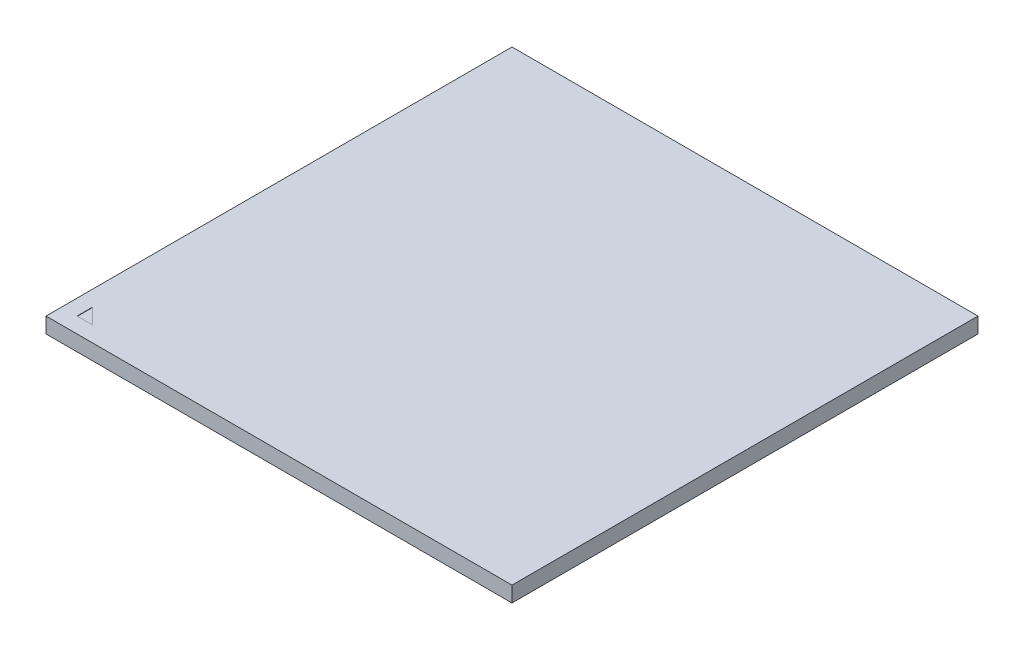
ISO-10303-21;
HEADER;
FILE_DESCRIPTION(('STEP AP214'),'2;1');
FILE_NAME('part.step','',(''),(''),'','','');
FILE_SCHEMA(('AUTOMOTIVE_DESIGN { 1 0 10303 214 1 1 1 1 }'));
ENDSEC;
DATA;
#1=APPLICATION_CONTEXT('core data for automotive mechanical design processes');
#2=APPLICATION_PROTOCOL_DEFINITION('international standard','automotive_design',2000,#1);
#3=PRODUCT_CONTEXT('',#1,'mechanical');
#4=PRODUCT('Part','Part','',(#3));
#5=PRODUCT_RELATED_PRODUCT_CATEGORY('part','',(#4));
#6=PRODUCT_DEFINITION_FORMATION('','',#4);
#7=PRODUCT_DEFINITION_CONTEXT('part definition',#1,'design');
#8=PRODUCT_DEFINITION('design','',#6,#7);
#9=PRODUCT_DEFINITION_SHAPE('','',#8);
#10=(LENGTH_UNIT() NAMED_UNIT(*) SI_UNIT(.MILLI.,.METRE.));
#11=(NAMED_UNIT(*) PLANE_ANGLE_UNIT() SI_UNIT($,.RADIAN.));
#12=(NAMED_UNIT(*) SI_UNIT($,.STERADIAN.) SOLID_ANGLE_UNIT());
#13=UNCERTAINTY_MEASURE_WITH_UNIT(LENGTH_MEASURE(1.E-05),#10,'distance_accuracy_value','');
#14=(GEOMETRIC_REPRESENTATION_CONTEXT(3) GLOBAL_UNCERTAINTY_ASSIGNED_CONTEXT((#13)) GLOBAL_UNIT_ASSIGNED_CONTEXT((#10,
#11,#12)) REPRESENTATION_CONTEXT('',''));
#15=CARTESIAN_POINT('',(0.,0.,0.));
#16=DIRECTION('',(0.,0.,1.));
#17=DIRECTION('',(1.,0.,0.));
#18=AXIS2_PLACEMENT_3D('',#15,#16,#17);
#19=CARTESIAN_POINT('',(-20.75,1.3,3.));
#20=DIRECTION('',(0.,0.,-1.));
#21=DIRECTION('',(-1.,0.,0.));
#22=AXIS2_PLACEMENT_3D('',#19,#20,#21);
#23=PLANE('',#22);
#24=DIRECTION('',(1.,0.,0.));
#25=VECTOR('',#24,1.);
#26=CARTESIAN_POINT('',(-20.75,0.8,3.));
#27=LINE('',#26,#25);
#28=CARTESIAN_POINT('',(-20.75,0.8,3.));
#29=VERTEX_POINT('',#28);
#30=CARTESIAN_POINT('',(-5.75,0.8,3.));
#31=VERTEX_POINT('',#30);
#32=EDGE_CURVE('E11',#29,#31,#27,.T.);
#33=ORIENTED_EDGE('',*,*,#32,.T.);
#34=DIRECTION('',(0.,-1.,0.));
#35=VECTOR('',#34,1.);
#36=CARTESIAN_POINT('',(-5.75,1.3,3.));
#37=LINE('',#36,#35);
#38=CARTESIAN_POINT('',(-5.75,1.3,3.));
#39=VERTEX_POINT('',#38);
#40=EDGE_CURVE('E36',#39,#31,#37,.T.);
#41=ORIENTED_EDGE('',*,*,#40,.F.);
#42=DIRECTION('',(1.,0.,0.));
#43=VECTOR('',#42,1.);
#44=CARTESIAN_POINT('',(-20.75,1.3,3.));
#45=LINE('',#44,#43);
#46=CARTESIAN_POINT('',(-20.75,1.3,3.));
#47=VERTEX_POINT('',#46);
#48=EDGE_CURVE('E116',#47,#39,#45,.T.);
#49=ORIENTED_EDGE('',*,*,#48,.F.);
#50=DIRECTION('',(0.,-1.,0.));
#51=VECTOR('',#50,1.);
#52=CARTESIAN_POINT('',(-20.75,1.3,3.));
#53=LINE('',#52,#51);
#54=EDGE_CURVE('E27',#47,#29,#53,.T.);
#55=ORIENTED_EDGE('',*,*,#54,.T.);
#56=EDGE_LOOP('',(#33,#41,#49,#55));
#57=FACE_BOUND('',#56,.T.);
#58=ADVANCED_FACE('F17',(#57),#23,.F.);
#59=CARTESIAN_POINT('',(-13.25,1.3,-4.5));
#60=DIRECTION('',(0.,1.,0.));
#61=DIRECTION('',(0.,0.,1.));
#62=AXIS2_PLACEMENT_3D('',#59,#60,#61);
#63=PLANE('',#62);
#64=DIRECTION('',(0.,0.,1.));
#65=VECTOR('',#64,1.);
#66=CARTESIAN_POINT('',(-20.25,1.3,2.5));
#67=LINE('',#66,#65);
#68=CARTESIAN_POINT('',(-20.25,1.3,2.));
#69=VERTEX_POINT('',#68);
#70=CARTESIAN_POINT('',(-20.25,1.3,2.5));
#71=VERTEX_POINT('',#70);
#72=EDGE_CURVE('E98',#69,#71,#67,.T.);
#73=ORIENTED_EDGE('',*,*,#72,.F.);
#74=DIRECTION('',(-0.707106781186548,0.,-0.707106781186548));
#75=VECTOR('',#74,1.);
#76=CARTESIAN_POINT('',(-20.25,1.3,2.));
#77=LINE('',#76,#75);
#78=CARTESIAN_POINT('',(-19.75,1.3,2.5));
#79=VERTEX_POINT('',#78);
#80=EDGE_CURVE('E92',#79,#69,#77,.T.);
#81=ORIENTED_EDGE('',*,*,#80,.F.);
#82=DIRECTION('',(1.,0.,0.));
#83=VECTOR('',#82,1.);
#84=CARTESIAN_POINT('',(-19.75,1.3,2.5));
#85=LINE('',#84,#83);
#86=EDGE_CURVE('E90',#71,#79,#85,.T.);
#87=ORIENTED_EDGE('',*,*,#86,.F.);
#88=EDGE_LOOP('',(#73,#81,#87));
#89=FACE_BOUND('',#88,.T.);
#90=DIRECTION('',(0.,0.,-1.));
#91=VECTOR('',#90,1.);
#92=CARTESIAN_POINT('',(-5.75,1.3,-12.));
#93=LINE('',#92,#91);
#94=CARTESIAN_POINT('',(-5.75,1.3,-12.));
#95=VERTEX_POINT('',#94);
#96=EDGE_CURVE('E107',#39,#95,#93,.T.);
#97=ORIENTED_EDGE('',*,*,#96,.T.);
#98=DIRECTION('',(-1.,0.,0.));
#99=VECTOR('',#98,1.);
#100=CARTESIAN_POINT('',(-20.75,1.3,-12.));
#101=LINE('',#100,#99);
#102=CARTESIAN_POINT('',(-20.75,1.3,-12.));
#103=VERTEX_POINT('',#102);
#104=EDGE_CURVE('E110',#95,#103,#101,.T.);
#105=ORIENTED_EDGE('',*,*,#104,.T.);
#106=DIRECTION('',(0.,0.,1.));
#107=VECTOR('',#106,1.);
#108=CARTESIAN_POINT('',(-20.75,1.3,-12.));
#109=LINE('',#108,#107);
#110=EDGE_CURVE('E113',#103,#47,#109,.T.);
#111=ORIENTED_EDGE('',*,*,#110,.T.);
#112=ORIENTED_EDGE('',*,*,#48,.T.);
#113=EDGE_LOOP('',(#97,#105,#111,#112));
#114=FACE_BOUND('',#113,.T.);
#115=ADVANCED_FACE('F145',(#89,#114),#63,.T.);
#116=CARTESIAN_POINT('',(-20.75,1.3,-12.));
#117=DIRECTION('',(1.,0.,0.));
#118=DIRECTION('',(0.,0.,-1.));
#119=AXIS2_PLACEMENT_3D('',#116,#117,#118);
#120=PLANE('',#119);
#121=DIRECTION('',(0.,0.,1.));
#122=VECTOR('',#121,1.);
#123=CARTESIAN_POINT('',(-20.75,0.8,-12.));
#124=LINE('',#123,#122);
#125=CARTESIAN_POINT('',(-20.75,0.8,-12.));
#126=VERTEX_POINT('',#125);
#127=EDGE_CURVE('E117',#126,#29,#124,.T.);
#128=ORIENTED_EDGE('',*,*,#127,.T.);
#129=ORIENTED_EDGE('',*,*,#54,.F.);
#130=ORIENTED_EDGE('',*,*,#110,.F.);
#131=DIRECTION('',(0.,-1.,0.));
#132=VECTOR('',#131,1.);
#133=CARTESIAN_POINT('',(-20.75,1.3,-12.));
#134=LINE('',#133,#132);
#135=EDGE_CURVE('E120',#103,#126,#134,.T.);
#136=ORIENTED_EDGE('',*,*,#135,.T.);
#137=EDGE_LOOP('',(#128,#129,#130,#136));
#138=FACE_BOUND('',#137,.T.);
#139=ADVANCED_FACE('F141',(#138),#120,.F.);
#140=CARTESIAN_POINT('',(-5.75,1.3,-12.));
#141=DIRECTION('',(-1.,0.,0.));
#142=DIRECTION('',(0.,0.,1.));
#143=AXIS2_PLACEMENT_3D('',#140,#141,#142);
#144=PLANE('',#143);
#145=DIRECTION('',(0.,0.,-1.));
#146=VECTOR('',#145,1.);
#147=CARTESIAN_POINT('',(-5.75,0.8,-12.));
#148=LINE('',#147,#146);
#149=CARTESIAN_POINT('',(-5.75,0.8,-12.));
#150=VERTEX_POINT('',#149);
#151=EDGE_CURVE('E122',#31,#150,#148,.T.);
#152=ORIENTED_EDGE('',*,*,#151,.T.);
#153=DIRECTION('',(0.,-1.,0.));
#154=VECTOR('',#153,1.);
#155=CARTESIAN_POINT('',(-5.75,1.3,-12.));
#156=LINE('',#155,#154);
#157=EDGE_CURVE('E100',#95,#150,#156,.T.);
#158=ORIENTED_EDGE('',*,*,#157,.F.);
#159=ORIENTED_EDGE('',*,*,#96,.F.);
#160=ORIENTED_EDGE('',*,*,#40,.T.);
#161=EDGE_LOOP('',(#152,#158,#159,#160));
#162=FACE_BOUND('',#161,.T.);
#163=ADVANCED_FACE('F146',(#162),#144,.F.);
#164=CARTESIAN_POINT('',(-20.75,1.3,-12.));
#165=DIRECTION('',(0.,0.,1.));
#166=DIRECTION('',(1.,0.,0.));
#167=AXIS2_PLACEMENT_3D('',#164,#165,#166);
#168=PLANE('',#167);
#169=DIRECTION('',(-1.,0.,0.));
#170=VECTOR('',#169,1.);
#171=CARTESIAN_POINT('',(-20.75,0.8,-12.));
#172=LINE('',#171,#170);
#173=EDGE_CURVE('E124',#150,#126,#172,.T.);
#174=ORIENTED_EDGE('',*,*,#173,.T.);
#175=ORIENTED_EDGE('',*,*,#135,.F.);
#176=ORIENTED_EDGE('',*,*,#104,.F.);
#177=ORIENTED_EDGE('',*,*,#157,.T.);
#178=EDGE_LOOP('',(#174,#175,#176,#177));
#179=FACE_BOUND('',#178,.T.);
#180=ADVANCED_FACE('F142',(#179),#168,.F.);
#181=CARTESIAN_POINT('',(-13.25,0.8,-4.5));
#182=DIRECTION('',(0.,1.,0.));
#183=DIRECTION('',(0.,0.,1.));
#184=AXIS2_PLACEMENT_3D('',#181,#182,#183);
#185=PLANE('',#184);
#186=ORIENTED_EDGE('',*,*,#151,.F.);
#187=ORIENTED_EDGE('',*,*,#32,.F.);
#188=ORIENTED_EDGE('',*,*,#127,.F.);
#189=ORIENTED_EDGE('',*,*,#173,.F.);
#190=EDGE_LOOP('',(#186,#187,#188,#189));
#191=FACE_BOUND('',#190,.T.);
#192=ADVANCED_FACE('F140',(#191),#185,.F.);
#193=CARTESIAN_POINT('',(-20.25,1.29,2.5));
#194=DIRECTION('',(-1.,0.,0.));
#195=DIRECTION('',(0.,0.,1.));
#196=AXIS2_PLACEMENT_3D('',#193,#194,#195);
#197=PLANE('',#196);
#198=ORIENTED_EDGE('',*,*,#72,.T.);
#199=DIRECTION('',(0.,1.,0.));
#200=VECTOR('',#199,1.);
#201=CARTESIAN_POINT('',(-20.25,1.29,2.5));
#202=LINE('',#201,#200);
#203=CARTESIAN_POINT('',(-20.25,1.29,2.5));
#204=VERTEX_POINT('',#203);
#205=EDGE_CURVE('E93',#204,#71,#202,.T.);
#206=ORIENTED_EDGE('',*,*,#205,.F.);
#207=DIRECTION('',(0.,0.,1.));
#208=VECTOR('',#207,1.);
#209=CARTESIAN_POINT('',(-20.25,1.29,2.5));
#210=LINE('',#209,#208);
#211=CARTESIAN_POINT('',(-20.25,1.29,2.));
#212=VERTEX_POINT('',#211);
#213=EDGE_CURVE('E72',#212,#204,#210,.T.);
#214=ORIENTED_EDGE('',*,*,#213,.F.);
#215=DIRECTION('',(0.,1.,0.));
#216=VECTOR('',#215,1.);
#217=CARTESIAN_POINT('',(-20.25,1.29,2.));
#218=LINE('',#217,#216);
#219=EDGE_CURVE('E82',#212,#69,#218,.T.);
#220=ORIENTED_EDGE('',*,*,#219,.T.);
#221=EDGE_LOOP('',(#198,#206,#214,#220));
#222=FACE_BOUND('',#221,.T.);
#223=ADVANCED_FACE('F165',(#222),#197,.F.);
#224=CARTESIAN_POINT('',(-20.25,1.29,2.));
#225=DIRECTION('',(0.707106781186548,0.,-0.707106781186548));
#226=DIRECTION('',(-0.707106781186548,0.,-0.707106781186548));
#227=AXIS2_PLACEMENT_3D('',#224,#225,#226);
#228=PLANE('',#227);
#229=ORIENTED_EDGE('',*,*,#80,.T.);
#230=ORIENTED_EDGE('',*,*,#219,.F.);
#231=DIRECTION('',(-0.707106781186548,0.,-0.707106781186548));
#232=VECTOR('',#231,1.);
#233=CARTESIAN_POINT('',(-20.25,1.29,2.));
#234=LINE('',#233,#232);
#235=CARTESIAN_POINT('',(-19.75,1.29,2.5));
#236=VERTEX_POINT('',#235);
#237=EDGE_CURVE('E78',#236,#212,#234,.T.);
#238=ORIENTED_EDGE('',*,*,#237,.F.);
#239=DIRECTION('',(0.,1.,0.));
#240=VECTOR('',#239,1.);
#241=CARTESIAN_POINT('',(-19.75,1.29,2.5));
#242=LINE('',#241,#240);
#243=EDGE_CURVE('E81',#236,#79,#242,.T.);
#244=ORIENTED_EDGE('',*,*,#243,.T.);
#245=EDGE_LOOP('',(#229,#230,#238,#244));
#246=FACE_BOUND('',#245,.T.);
#247=ADVANCED_FACE('F80',(#246),#228,.F.);
#248=CARTESIAN_POINT('',(-19.75,1.29,2.5));
#249=DIRECTION('',(0.,0.,1.));
#250=DIRECTION('',(1.,0.,0.));
#251=AXIS2_PLACEMENT_3D('',#248,#249,#250);
#252=PLANE('',#251);
#253=ORIENTED_EDGE('',*,*,#86,.T.);
#254=ORIENTED_EDGE('',*,*,#243,.F.);
#255=DIRECTION('',(1.,0.,0.));
#256=VECTOR('',#255,1.);
#257=CARTESIAN_POINT('',(-19.75,1.29,2.5));
#258=LINE('',#257,#256);
#259=EDGE_CURVE('E21',#204,#236,#258,.T.);
#260=ORIENTED_EDGE('',*,*,#259,.F.);
#261=ORIENTED_EDGE('',*,*,#205,.T.);
#262=EDGE_LOOP('',(#253,#254,#260,#261));
#263=FACE_BOUND('',#262,.T.);
#264=ADVANCED_FACE('F88',(#263),#252,.F.);
#265=CARTESIAN_POINT('',(-13.25,1.29,-4.5));
#266=DIRECTION('',(0.,1.,0.));
#267=DIRECTION('',(0.,0.,1.));
#268=AXIS2_PLACEMENT_3D('',#265,#266,#267);
#269=PLANE('',#268);
#270=ORIENTED_EDGE('',*,*,#213,.T.);
#271=ORIENTED_EDGE('',*,*,#259,.T.);
#272=ORIENTED_EDGE('',*,*,#237,.T.);
#273=EDGE_LOOP('',(#270,#271,#272));
#274=FACE_BOUND('',#273,.T.);
#275=ADVANCED_FACE('F19',(#274),#269,.T.);
#276=CLOSED_SHELL('',(#58,#115,#139,#163,#180,#192,#223,#247,#264,#275));
#277=MANIFOLD_SOLID_BREP('B1',#276);
#278=ADVANCED_BREP_SHAPE_REPRESENTATION('',(#18,#277),#14);
#279=SHAPE_DEFINITION_REPRESENTATION(#9,#278);
ENDSEC;
END-ISO-10303-21;
